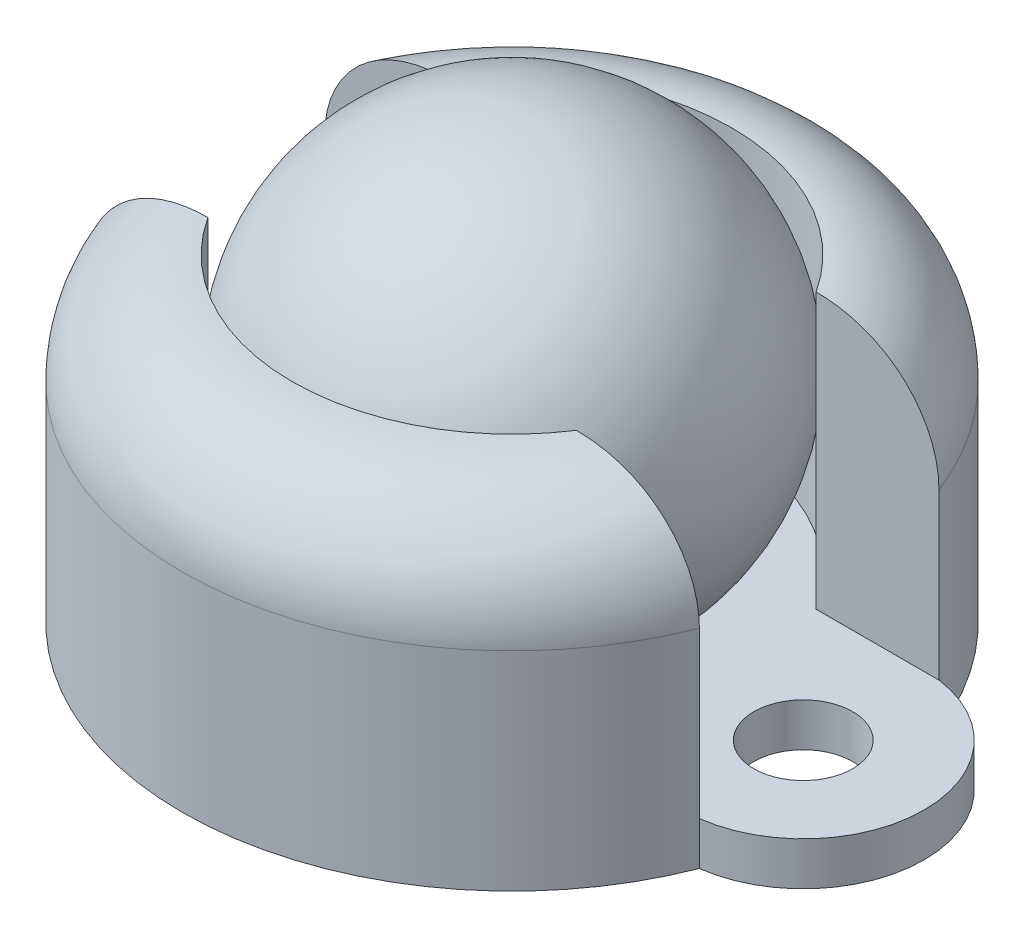
ISO-10303-21;
HEADER;
FILE_DESCRIPTION(('STEP AP214'),'2;1');
FILE_NAME('part.step','',(''),(''),'','','');
FILE_SCHEMA(('AUTOMOTIVE_DESIGN { 1 0 10303 214 1 1 1 1 }'));
ENDSEC;
DATA;
#1=APPLICATION_CONTEXT('core data for automotive mechanical design processes');
#2=APPLICATION_PROTOCOL_DEFINITION('international standard','automotive_design',2000,#1);
#3=PRODUCT_CONTEXT('',#1,'mechanical');
#4=PRODUCT('Part','Part','',(#3));
#5=PRODUCT_RELATED_PRODUCT_CATEGORY('part','',(#4));
#6=PRODUCT_DEFINITION_FORMATION('','',#4);
#7=PRODUCT_DEFINITION_CONTEXT('part definition',#1,'design');
#8=PRODUCT_DEFINITION('design','',#6,#7);
#9=PRODUCT_DEFINITION_SHAPE('','',#8);
#10=(LENGTH_UNIT() NAMED_UNIT(*) SI_UNIT(.MILLI.,.METRE.));
#11=(NAMED_UNIT(*) PLANE_ANGLE_UNIT() SI_UNIT($,.RADIAN.));
#12=(NAMED_UNIT(*) SI_UNIT($,.STERADIAN.) SOLID_ANGLE_UNIT());
#13=UNCERTAINTY_MEASURE_WITH_UNIT(LENGTH_MEASURE(1.E-05),#10,'distance_accuracy_value','');
#14=(GEOMETRIC_REPRESENTATION_CONTEXT(3) GLOBAL_UNCERTAINTY_ASSIGNED_CONTEXT((#13)) GLOBAL_UNIT_ASSIGNED_CONTEXT((#10,
#11,#12)) REPRESENTATION_CONTEXT('',''));
#15=CARTESIAN_POINT('',(0.,0.,0.));
#16=DIRECTION('',(0.,0.,1.));
#17=DIRECTION('',(1.,0.,0.));
#18=AXIS2_PLACEMENT_3D('',#15,#16,#17);
#19=CARTESIAN_POINT('',(9.525,5.08,-7.62));
#20=DIRECTION('',(0.,1.,0.));
#21=DIRECTION('',(-1.,0.,0.));
#22=AXIS2_PLACEMENT_3D('',#19,#20,#21);
#23=SPHERICAL_SURFACE('',#22,5.08);
#24=CARTESIAN_POINT('',(9.525,10.16,-7.62));
#25=VERTEX_POINT('',#24);
#26=VERTEX_LOOP('',#25);
#27=FACE_BOUND('',#26,.T.);
#28=ADVANCED_FACE('F40',(#27),#23,.T.);
#29=CLOSED_SHELL('',(#28));
#30=MANIFOLD_SOLID_BREP('B2',#29);
#31=CARTESIAN_POINT('',(6.1595,1.,-7.62));
#32=DIRECTION('',(0.,1.,0.));
#33=DIRECTION('',(0.,0.,1.));
#34=AXIS2_PLACEMENT_3D('',#31,#32,#33);
#35=PLANE('',#34);
#36=CARTESIAN_POINT('',(9.525,1.,-7.62));
#37=DIRECTION('',(0.,1.,0.));
#38=DIRECTION('',(0.,0.,1.));
#39=AXIS2_PLACEMENT_3D('',#36,#37,#38);
#40=CIRCLE('',#39,3.11073125347721);
#41=CARTESIAN_POINT('',(9.525,0.999999999999999,-10.7307312534772));
#42=VERTEX_POINT('',#41);
#43=EDGE_CURVE('E166',#42,#42,#40,.F.);
#44=ORIENTED_EDGE('',*,*,#43,.T.);
#45=EDGE_LOOP('',(#44));
#46=FACE_BOUND('',#45,.T.);
#47=CARTESIAN_POINT('',(2.794,1.,-7.62));
#48=DIRECTION('',(0.,1.,0.));
#49=DIRECTION('',(0.,0.,1.));
#50=AXIS2_PLACEMENT_3D('',#47,#48,#49);
#51=CIRCLE('',#50,1.143);
#52=CARTESIAN_POINT('',(2.794,1.,-6.477));
#53=VERTEX_POINT('',#52);
#54=EDGE_CURVE('E195',#53,#53,#51,.T.);
#55=ORIENTED_EDGE('',*,*,#54,.F.);
#56=EDGE_LOOP('',(#55));
#57=FACE_BOUND('',#56,.T.);
#58=CARTESIAN_POINT('',(16.256,1.,-7.62));
#59=DIRECTION('',(0.,1.,0.));
#60=DIRECTION('',(0.,0.,1.));
#61=AXIS2_PLACEMENT_3D('',#58,#59,#60);
#62=CIRCLE('',#61,1.143);
#63=CARTESIAN_POINT('',(16.256,1.,-6.477));
#64=VERTEX_POINT('',#63);
#65=EDGE_CURVE('E201',#64,#64,#62,.T.);
#66=ORIENTED_EDGE('',*,*,#65,.F.);
#67=EDGE_LOOP('',(#66));
#68=FACE_BOUND('',#67,.T.);
#69=CARTESIAN_POINT('',(9.525,1.,-7.62));
#70=DIRECTION('',(0.,-1.,0.));
#71=DIRECTION('',(0.,0.,1.));
#72=AXIS2_PLACEMENT_3D('',#69,#70,#71);
#73=CIRCLE('',#72,5.08);
#74=CARTESIAN_POINT('',(13.7835509398856,1.,-4.8503170050709));
#75=VERTEX_POINT('',#74);
#76=CARTESIAN_POINT('',(5.26644906011439,1.,-4.8503170050709));
#77=VERTEX_POINT('',#76);
#78=EDGE_CURVE('E162',#75,#77,#73,.T.);
#79=ORIENTED_EDGE('',*,*,#78,.F.);
#80=DIRECTION('',(-1.,0.,0.));
#81=VECTOR('',#80,1.);
#82=CARTESIAN_POINT('',(13.7835509398856,1.,-4.8503170050709));
#83=LINE('',#82,#81);
#84=CARTESIAN_POINT('',(16.623820754717,1.,-4.8503170050709));
#85=VERTEX_POINT('',#84);
#86=EDGE_CURVE('E148',#85,#75,#83,.T.);
#87=ORIENTED_EDGE('',*,*,#86,.F.);
#88=CARTESIAN_POINT('',(16.256,1.,-7.62));
#89=DIRECTION('',(0.,1.,0.));
#90=DIRECTION('',(0.,0.,1.));
#91=AXIS2_PLACEMENT_3D('',#88,#89,#90);
#92=CIRCLE('',#91,2.794);
#93=CARTESIAN_POINT('',(16.623820754717,1.,-10.3896829949291));
#94=VERTEX_POINT('',#93);
#95=EDGE_CURVE('E210',#85,#94,#92,.T.);
#96=ORIENTED_EDGE('',*,*,#95,.T.);
#97=DIRECTION('',(1.,0.,0.));
#98=VECTOR('',#97,1.);
#99=CARTESIAN_POINT('',(16.623820754717,1.,-10.3896829949291));
#100=LINE('',#99,#98);
#101=CARTESIAN_POINT('',(13.7835509398856,1.,-10.3896829949291));
#102=VERTEX_POINT('',#101);
#103=EDGE_CURVE('E177',#102,#94,#100,.T.);
#104=ORIENTED_EDGE('',*,*,#103,.F.);
#105=CARTESIAN_POINT('',(9.525,1.,-7.62));
#106=DIRECTION('',(0.,-1.,0.));
#107=DIRECTION('',(0.,0.,1.));
#108=AXIS2_PLACEMENT_3D('',#105,#106,#107);
#109=CIRCLE('',#108,5.08);
#110=CARTESIAN_POINT('',(5.26644906011439,1.,-10.3896829949291));
#111=VERTEX_POINT('',#110);
#112=EDGE_CURVE('E180',#111,#102,#109,.T.);
#113=ORIENTED_EDGE('',*,*,#112,.F.);
#114=DIRECTION('',(1.,0.,0.));
#115=VECTOR('',#114,1.);
#116=CARTESIAN_POINT('',(5.26644906011439,1.,-10.3896829949291));
#117=LINE('',#116,#115);
#118=CARTESIAN_POINT('',(2.42617924528302,1.,-10.3896829949291));
#119=VERTEX_POINT('',#118);
#120=EDGE_CURVE('E172',#119,#111,#117,.T.);
#121=ORIENTED_EDGE('',*,*,#120,.F.);
#122=CARTESIAN_POINT('',(2.794,1.,-7.62));
#123=DIRECTION('',(0.,1.,0.));
#124=DIRECTION('',(0.,0.,1.));
#125=AXIS2_PLACEMENT_3D('',#122,#123,#124);
#126=CIRCLE('',#125,2.794);
#127=CARTESIAN_POINT('',(2.42617924528302,1.,-4.8503170050709));
#128=VERTEX_POINT('',#127);
#129=EDGE_CURVE('E207',#119,#128,#126,.T.);
#130=ORIENTED_EDGE('',*,*,#129,.T.);
#131=DIRECTION('',(-1.,0.,0.));
#132=VECTOR('',#131,1.);
#133=CARTESIAN_POINT('',(2.42617924528302,1.,-4.8503170050709));
#134=LINE('',#133,#132);
#135=EDGE_CURVE('E158',#77,#128,#134,.T.);
#136=ORIENTED_EDGE('',*,*,#135,.F.);
#137=EDGE_LOOP('',(#79,#87,#96,#104,#113,#121,#130,#136));
#138=FACE_BOUND('',#137,.T.);
#139=ADVANCED_FACE('F52',(#46,#57,#68,#138),#35,.T.);
#140=CARTESIAN_POINT('',(6.1595,0.,-7.62));
#141=DIRECTION('',(0.,1.,0.));
#142=DIRECTION('',(0.,0.,1.));
#143=AXIS2_PLACEMENT_3D('',#140,#141,#142);
#144=PLANE('',#143);
#145=CARTESIAN_POINT('',(9.525,0.,-7.62));
#146=DIRECTION('',(0.,-1.,0.));
#147=DIRECTION('',(0.,0.,-1.));
#148=AXIS2_PLACEMENT_3D('',#145,#146,#147);
#149=CIRCLE('',#148,3.11073125347721);
#150=CARTESIAN_POINT('',(9.525,0.,-10.7307312534772));
#151=VERTEX_POINT('',#150);
#152=EDGE_CURVE('E442',#151,#151,#149,.T.);
#153=ORIENTED_EDGE('',*,*,#152,.F.);
#154=EDGE_LOOP('',(#153));
#155=FACE_BOUND('',#154,.T.);
#156=CARTESIAN_POINT('',(16.256,0.,-7.62));
#157=DIRECTION('',(0.,1.,0.));
#158=DIRECTION('',(0.,0.,1.));
#159=AXIS2_PLACEMENT_3D('',#156,#157,#158);
#160=CIRCLE('',#159,1.143);
#161=CARTESIAN_POINT('',(16.256,0.,-6.477));
#162=VERTEX_POINT('',#161);
#163=EDGE_CURVE('E198',#162,#162,#160,.T.);
#164=ORIENTED_EDGE('',*,*,#163,.T.);
#165=EDGE_LOOP('',(#164));
#166=FACE_BOUND('',#165,.T.);
#167=CARTESIAN_POINT('',(9.525,0.,-7.62));
#168=DIRECTION('',(0.,1.,0.));
#169=DIRECTION('',(0.,0.,1.));
#170=AXIS2_PLACEMENT_3D('',#167,#168,#169);
#171=CIRCLE('',#170,7.62);
#172=CARTESIAN_POINT('',(16.623820754717,0.,-10.3896829949291));
#173=VERTEX_POINT('',#172);
#174=CARTESIAN_POINT('',(2.42617924528302,0.,-10.3896829949291));
#175=VERTEX_POINT('',#174);
#176=EDGE_CURVE('E204',#173,#175,#171,.T.);
#177=ORIENTED_EDGE('',*,*,#176,.F.);
#178=CARTESIAN_POINT('',(16.256,0.,-7.62));
#179=DIRECTION('',(0.,1.,0.));
#180=DIRECTION('',(0.,0.,1.));
#181=AXIS2_PLACEMENT_3D('',#178,#179,#180);
#182=CIRCLE('',#181,2.794);
#183=CARTESIAN_POINT('',(16.623820754717,0.,-4.8503170050709));
#184=VERTEX_POINT('',#183);
#185=EDGE_CURVE('E211',#184,#173,#182,.T.);
#186=ORIENTED_EDGE('',*,*,#185,.F.);
#187=CARTESIAN_POINT('',(9.525,0.,-7.62));
#188=DIRECTION('',(0.,1.,0.));
#189=DIRECTION('',(0.,0.,1.));
#190=AXIS2_PLACEMENT_3D('',#187,#188,#189);
#191=CIRCLE('',#190,7.62);
#192=CARTESIAN_POINT('',(2.42617924528302,0.,-4.8503170050709));
#193=VERTEX_POINT('',#192);
#194=EDGE_CURVE('E219',#193,#184,#191,.T.);
#195=ORIENTED_EDGE('',*,*,#194,.F.);
#196=CARTESIAN_POINT('',(2.794,0.,-7.62));
#197=DIRECTION('',(0.,1.,0.));
#198=DIRECTION('',(0.,0.,1.));
#199=AXIS2_PLACEMENT_3D('',#196,#197,#198);
#200=CIRCLE('',#199,2.794);
#201=EDGE_CURVE('E217',#175,#193,#200,.T.);
#202=ORIENTED_EDGE('',*,*,#201,.F.);
#203=EDGE_LOOP('',(#177,#186,#195,#202));
#204=FACE_BOUND('',#203,.T.);
#205=CARTESIAN_POINT('',(2.794,0.,-7.62));
#206=DIRECTION('',(0.,1.,0.));
#207=DIRECTION('',(0.,0.,1.));
#208=AXIS2_PLACEMENT_3D('',#205,#206,#207);
#209=CIRCLE('',#208,1.143);
#210=CARTESIAN_POINT('',(2.794,0.,-6.477));
#211=VERTEX_POINT('',#210);
#212=EDGE_CURVE('E194',#211,#211,#209,.T.);
#213=ORIENTED_EDGE('',*,*,#212,.T.);
#214=EDGE_LOOP('',(#213));
#215=FACE_BOUND('',#214,.T.);
#216=ADVANCED_FACE('F280',(#155,#166,#204,#215),#144,.F.);
#217=CARTESIAN_POINT('',(9.525,1.,-7.62));
#218=DIRECTION('',(0.,-1.,0.));
#219=DIRECTION('',(0.,0.,-1.));
#220=AXIS2_PLACEMENT_3D('',#217,#218,#219);
#221=CYLINDRICAL_SURFACE('',#220,7.62);
#222=DIRECTION('',(0.,-1.,0.));
#223=VECTOR('',#222,1.);
#224=CARTESIAN_POINT('',(2.42617924528302,7.35,-10.3896829949291));
#225=LINE('',#224,#223);
#226=CARTESIAN_POINT('',(2.42617924528302,4.81,-10.3896829949291));
#227=VERTEX_POINT('',#226);
#228=EDGE_CURVE('E192',#227,#119,#225,.T.);
#229=ORIENTED_EDGE('',*,*,#228,.F.);
#230=CARTESIAN_POINT('',(9.525,4.81,-7.62));
#231=DIRECTION('',(0.,1.,0.));
#232=DIRECTION('',(0.,0.,1.));
#233=AXIS2_PLACEMENT_3D('',#230,#231,#232);
#234=CIRCLE('',#233,7.62);
#235=CARTESIAN_POINT('',(16.623820754717,4.81,-10.3896829949291));
#236=VERTEX_POINT('',#235);
#237=EDGE_CURVE('E65',#227,#236,#234,.F.);
#238=ORIENTED_EDGE('',*,*,#237,.T.);
#239=DIRECTION('',(0.,-1.,0.));
#240=VECTOR('',#239,1.);
#241=CARTESIAN_POINT('',(16.623820754717,7.35,-10.3896829949291));
#242=LINE('',#241,#240);
#243=EDGE_CURVE('E176',#236,#94,#242,.T.);
#244=ORIENTED_EDGE('',*,*,#243,.T.);
#245=DIRECTION('',(0.,-1.,0.));
#246=VECTOR('',#245,1.);
#247=CARTESIAN_POINT('',(16.623820754717,1.,-10.3896829949291));
#248=LINE('',#247,#246);
#249=EDGE_CURVE('E214',#94,#173,#248,.T.);
#250=ORIENTED_EDGE('',*,*,#249,.T.);
#251=ORIENTED_EDGE('',*,*,#176,.T.);
#252=DIRECTION('',(0.,-1.,0.));
#253=VECTOR('',#252,1.);
#254=CARTESIAN_POINT('',(2.42617924528302,1.,-10.3896829949291));
#255=LINE('',#254,#253);
#256=EDGE_CURVE('E141',#119,#175,#255,.T.);
#257=ORIENTED_EDGE('',*,*,#256,.F.);
#258=EDGE_LOOP('',(#229,#238,#244,#250,#251,#257));
#259=FACE_BOUND('',#258,.T.);
#260=ADVANCED_FACE('F286',(#259),#221,.T.);
#261=CARTESIAN_POINT('',(2.794,1.,-7.62));
#262=DIRECTION('',(0.,-1.,0.));
#263=DIRECTION('',(0.,0.,-1.));
#264=AXIS2_PLACEMENT_3D('',#261,#262,#263);
#265=CYLINDRICAL_SURFACE('',#264,2.794);
#266=ORIENTED_EDGE('',*,*,#201,.T.);
#267=DIRECTION('',(0.,-1.,0.));
#268=VECTOR('',#267,1.);
#269=CARTESIAN_POINT('',(2.42617924528302,1.,-4.8503170050709));
#270=LINE('',#269,#268);
#271=EDGE_CURVE('E227',#128,#193,#270,.T.);
#272=ORIENTED_EDGE('',*,*,#271,.F.);
#273=ORIENTED_EDGE('',*,*,#129,.F.);
#274=ORIENTED_EDGE('',*,*,#256,.T.);
#275=EDGE_LOOP('',(#266,#272,#273,#274));
#276=FACE_BOUND('',#275,.T.);
#277=ADVANCED_FACE('F300',(#276),#265,.T.);
#278=CARTESIAN_POINT('',(9.525,1.,-7.62));
#279=DIRECTION('',(0.,-1.,0.));
#280=DIRECTION('',(0.,0.,-1.));
#281=AXIS2_PLACEMENT_3D('',#278,#279,#280);
#282=CYLINDRICAL_SURFACE('',#281,7.62);
#283=DIRECTION('',(0.,-1.,0.));
#284=VECTOR('',#283,1.);
#285=CARTESIAN_POINT('',(16.623820754717,7.35,-4.8503170050709));
#286=LINE('',#285,#284);
#287=CARTESIAN_POINT('',(16.623820754717,4.81,-4.8503170050709));
#288=VERTEX_POINT('',#287);
#289=EDGE_CURVE('E151',#288,#85,#286,.T.);
#290=ORIENTED_EDGE('',*,*,#289,.F.);
#291=CARTESIAN_POINT('',(9.525,4.81,-7.62));
#292=DIRECTION('',(0.,1.,0.));
#293=DIRECTION('',(0.,0.,1.));
#294=AXIS2_PLACEMENT_3D('',#291,#292,#293);
#295=CIRCLE('',#294,7.62);
#296=CARTESIAN_POINT('',(2.42617924528302,4.81,-4.8503170050709));
#297=VERTEX_POINT('',#296);
#298=EDGE_CURVE('E138',#288,#297,#295,.F.);
#299=ORIENTED_EDGE('',*,*,#298,.T.);
#300=DIRECTION('',(0.,-1.,0.));
#301=VECTOR('',#300,1.);
#302=CARTESIAN_POINT('',(2.42617924528302,7.35,-4.8503170050709));
#303=LINE('',#302,#301);
#304=EDGE_CURVE('E157',#297,#128,#303,.T.);
#305=ORIENTED_EDGE('',*,*,#304,.T.);
#306=ORIENTED_EDGE('',*,*,#271,.T.);
#307=ORIENTED_EDGE('',*,*,#194,.T.);
#308=DIRECTION('',(0.,-1.,0.));
#309=VECTOR('',#308,1.);
#310=CARTESIAN_POINT('',(16.623820754717,1.,-4.8503170050709));
#311=LINE('',#310,#309);
#312=EDGE_CURVE('E224',#85,#184,#311,.T.);
#313=ORIENTED_EDGE('',*,*,#312,.F.);
#314=EDGE_LOOP('',(#290,#299,#305,#306,#307,#313));
#315=FACE_BOUND('',#314,.T.);
#316=ADVANCED_FACE('F296',(#315),#282,.T.);
#317=CARTESIAN_POINT('',(16.256,1.,-7.62));
#318=DIRECTION('',(0.,-1.,0.));
#319=DIRECTION('',(0.,0.,-1.));
#320=AXIS2_PLACEMENT_3D('',#317,#318,#319);
#321=CYLINDRICAL_SURFACE('',#320,2.794);
#322=ORIENTED_EDGE('',*,*,#185,.T.);
#323=ORIENTED_EDGE('',*,*,#249,.F.);
#324=ORIENTED_EDGE('',*,*,#95,.F.);
#325=ORIENTED_EDGE('',*,*,#312,.T.);
#326=EDGE_LOOP('',(#322,#323,#324,#325));
#327=FACE_BOUND('',#326,.T.);
#328=ADVANCED_FACE('F293',(#327),#321,.T.);
#329=CARTESIAN_POINT('',(16.256,1.,-7.62));
#330=DIRECTION('',(0.,-1.,0.));
#331=DIRECTION('',(0.,0.,-1.));
#332=AXIS2_PLACEMENT_3D('',#329,#330,#331);
#333=CYLINDRICAL_SURFACE('',#332,1.143);
#334=ORIENTED_EDGE('',*,*,#65,.T.);
#335=EDGE_LOOP('',(#334));
#336=FACE_BOUND('',#335,.T.);
#337=ORIENTED_EDGE('',*,*,#163,.F.);
#338=EDGE_LOOP('',(#337));
#339=FACE_BOUND('',#338,.T.);
#340=ADVANCED_FACE('F291',(#336,#339),#333,.F.);
#341=CARTESIAN_POINT('',(2.794,1.,-7.62));
#342=DIRECTION('',(0.,-1.,0.));
#343=DIRECTION('',(0.,0.,-1.));
#344=AXIS2_PLACEMENT_3D('',#341,#342,#343);
#345=CYLINDRICAL_SURFACE('',#344,1.143);
#346=ORIENTED_EDGE('',*,*,#54,.T.);
#347=EDGE_LOOP('',(#346));
#348=FACE_BOUND('',#347,.T.);
#349=ORIENTED_EDGE('',*,*,#212,.F.);
#350=EDGE_LOOP('',(#349));
#351=FACE_BOUND('',#350,.T.);
#352=ADVANCED_FACE('F256',(#348,#351),#345,.F.);
#353=CARTESIAN_POINT('',(5.26644906011439,7.35,-10.3896829949291));
#354=DIRECTION('',(0.,0.,-1.));
#355=DIRECTION('',(-1.,0.,0.));
#356=AXIS2_PLACEMENT_3D('',#353,#354,#355);
#357=PLANE('',#356);
#358=DIRECTION('',(0.,-1.,0.));
#359=VECTOR('',#358,1.);
#360=CARTESIAN_POINT('',(5.26644906011439,7.35,-10.3896829949291));
#361=LINE('',#360,#359);
#362=CARTESIAN_POINT('',(5.26644906011439,7.35,-10.3896829949291));
#363=VERTEX_POINT('',#362);
#364=EDGE_CURVE('E189',#363,#111,#361,.T.);
#365=ORIENTED_EDGE('',*,*,#364,.F.);
#366=CARTESIAN_POINT('',(5.26644906011439,7.35,-10.3896829949291));
#367=CARTESIAN_POINT('',(5.17678454034011,7.35001114301184,-10.3896829949291));
#368=CARTESIAN_POINT('',(5.08709035167764,7.34666318377569,-10.3896829949291));
#369=CARTESIAN_POINT('',(4.9081687511275,7.33294182209064,-10.3896829949291));
#370=CARTESIAN_POINT('',(4.81894180117011,7.32256244628566,-10.3896829949291));
#371=CARTESIAN_POINT('',(4.64107123501664,7.29438057945804,-10.3896829949291));
#372=CARTESIAN_POINT('',(4.55243494401416,7.27653127182482,-10.3896829949291));
#373=CARTESIAN_POINT('',(4.37706396337135,7.23319933483167,-10.3896829949291));
#374=CARTESIAN_POINT('',(4.29032878552236,7.20771869045276,-10.3896829949291));
#375=CARTESIAN_POINT('',(4.11903510750667,7.1488347460405,-10.3896829949291));
#376=CARTESIAN_POINT('',(4.03449151552459,7.11538788118175,-10.3896829949291));
#377=CARTESIAN_POINT('',(3.86895239000286,7.04064292127525,-10.3896829949291));
#378=CARTESIAN_POINT('',(3.78795644179326,6.99934574684835,-10.3896829949291));
#379=CARTESIAN_POINT('',(3.63061048251926,6.90912848125866,-10.3896829949291));
#380=CARTESIAN_POINT('',(3.55424803319991,6.86023017917681,-10.3896829949291));
#381=CARTESIAN_POINT('',(3.40686682866429,6.75501343573417,-10.3896829949291));
#382=CARTESIAN_POINT('',(3.33584702685674,6.69869645362427,-10.3896829949291));
#383=CARTESIAN_POINT('',(3.15012624930728,6.53498401032006,-10.3896829949291));
#384=CARTESIAN_POINT('',(3.04158627175307,6.4204175341252,-10.3896829949291));
#385=CARTESIAN_POINT('',(2.84777585848162,6.17297593284659,-10.3896829949291));
#386=CARTESIAN_POINT('',(2.76251200346626,6.04009564596838,-10.3896829949291));
#387=CARTESIAN_POINT('',(2.62600826780199,5.77392960898687,-10.3896829949291));
#388=CARTESIAN_POINT('',(2.57228418304128,5.64191284328987,-10.3896829949291));
#389=CARTESIAN_POINT('',(2.4891437345482,5.37058554296885,-10.3896829949291));
#390=CARTESIAN_POINT('',(2.45967774291546,5.23129052280352,-10.3896829949291));
#391=CARTESIAN_POINT('',(2.43731254898599,5.0440796686978,-10.3896829949291));
#392=CARTESIAN_POINT('',(2.43313647619791,4.99732352363476,-10.3896829949291));
#393=CARTESIAN_POINT('',(2.42757358486635,4.90371887924745,-10.3896829949291));
#394=CARTESIAN_POINT('',(2.42618241588989,4.85687063858525,-10.3896829949291));
#395=CARTESIAN_POINT('',(2.42617924528288,4.81000000000002,-10.3896829949291));
#396=B_SPLINE_CURVE_WITH_KNOTS('',3,(#366,#367,#368,#369,#370,#371,#372,#373,#374,#375,#376,
#377,#378,#379,#380,#381,#382,#383,#384,#385,#386,#387,#388,#389,#390,#391,#392,#393,#394,#395),
.UNSPECIFIED.,.F.,.F.,(4,2,2,2,2,2,2,2,2,2,2,2,2,2,4),(0.,0.268974742641966,0.538178272763039,
0.809094876620579,1.07994107368282,1.35230390400546,1.62463481349964,1.89619899630935,
2.16770984211061,2.63833307617677,3.1090892289134,3.53455417736994,3.95914651911413,
4.09991316025373,4.24045973087649),.UNSPECIFIED.);
#397=EDGE_CURVE('E79',#363,#227,#396,.T.);
#398=ORIENTED_EDGE('',*,*,#397,.T.);
#399=ORIENTED_EDGE('',*,*,#228,.T.);
#400=ORIENTED_EDGE('',*,*,#120,.T.);
#401=EDGE_LOOP('',(#365,#398,#399,#400));
#402=FACE_BOUND('',#401,.T.);
#403=ADVANCED_FACE('F251',(#402),#357,.F.);
#404=CARTESIAN_POINT('',(9.525,7.35,-7.62));
#405=DIRECTION('',(0.,-1.,0.));
#406=DIRECTION('',(0.,0.,-1.));
#407=AXIS2_PLACEMENT_3D('',#404,#405,#406);
#408=CYLINDRICAL_SURFACE('',#407,5.08);
#409=ORIENTED_EDGE('',*,*,#112,.T.);
#410=DIRECTION('',(0.,-1.,0.));
#411=VECTOR('',#410,1.);
#412=CARTESIAN_POINT('',(13.7835509398856,7.35,-10.3896829949291));
#413=LINE('',#412,#411);
#414=CARTESIAN_POINT('',(13.7835509398856,7.35,-10.3896829949291));
#415=VERTEX_POINT('',#414);
#416=EDGE_CURVE('E186',#415,#102,#413,.T.);
#417=ORIENTED_EDGE('',*,*,#416,.F.);
#418=CARTESIAN_POINT('',(9.525,7.35,-7.62));
#419=DIRECTION('',(0.,-1.,0.));
#420=DIRECTION('',(0.,0.,1.));
#421=AXIS2_PLACEMENT_3D('',#418,#419,#420);
#422=CIRCLE('',#421,5.08);
#423=EDGE_CURVE('E173',#363,#415,#422,.T.);
#424=ORIENTED_EDGE('',*,*,#423,.F.);
#425=ORIENTED_EDGE('',*,*,#364,.T.);
#426=EDGE_LOOP('',(#409,#417,#424,#425));
#427=FACE_BOUND('',#426,.T.);
#428=ADVANCED_FACE('F247',(#427),#408,.F.);
#429=CARTESIAN_POINT('',(16.623820754717,7.35,-10.3896829949291));
#430=DIRECTION('',(0.,0.,-1.));
#431=DIRECTION('',(-1.,0.,0.));
#432=AXIS2_PLACEMENT_3D('',#429,#430,#431);
#433=PLANE('',#432);
#434=ORIENTED_EDGE('',*,*,#243,.F.);
#435=CARTESIAN_POINT('',(16.623820754717,4.81,-10.3896829949291));
#436=CARTESIAN_POINT('',(16.6238294758465,4.87753487017368,-10.3896829949291));
#437=CARTESIAN_POINT('',(16.6209296585075,4.94506558061485,-10.3896829949291));
#438=CARTESIAN_POINT('',(16.6093799939002,5.07962412517109,-10.3896829949291));
#439=CARTESIAN_POINT('',(16.6007309674432,5.14665202969018,-10.3896829949291));
#440=CARTESIAN_POINT('',(16.5777753836263,5.27958237028461,-10.3896829949291));
#441=CARTESIAN_POINT('',(16.5634814179348,5.34548697300761,-10.3896829949291));
#442=CARTESIAN_POINT('',(16.5293806539561,5.47583540913131,-10.3896829949291));
#443=CARTESIAN_POINT('',(16.5095738284585,5.54027923532022,-10.3896829949291));
#444=CARTESIAN_POINT('',(16.4421206685347,5.73074347465564,-10.3896829949291));
#445=CARTESIAN_POINT('',(16.3864209511575,5.85401513642086,-10.3896829949291));
#446=CARTESIAN_POINT('',(16.2555451501697,6.08966356295821,-10.3896829949291));
#447=CARTESIAN_POINT('',(16.1803638697385,6.20203740966577,-10.3896829949291));
#448=CARTESIAN_POINT('',(16.0112232916338,6.41552780767406,-10.3896829949291));
#449=CARTESIAN_POINT('',(15.9169012884716,6.51635684028777,-10.3896829949291));
#450=CARTESIAN_POINT('',(15.7135796651386,6.70181738451991,-10.3896829949291));
#451=CARTESIAN_POINT('',(15.6045812423863,6.78645021619014,-10.3896829949291));
#452=CARTESIAN_POINT('',(15.367968521372,6.94292749640816,-10.3896829949291));
#453=CARTESIAN_POINT('',(15.2396204440162,7.01366015319299,-10.3896829949291));
#454=CARTESIAN_POINT('',(14.9735537276223,7.13483540201934,-10.3896829949291));
#455=CARTESIAN_POINT('',(14.8358217967293,7.18524848307452,-10.3896829949291));
#456=CARTESIAN_POINT('',(14.5470195480957,7.26800625190271,-10.3896829949291));
#457=CARTESIAN_POINT('',(14.3956300337775,7.29923693953247,-10.3896829949291));
#458=CARTESIAN_POINT('',(14.1667963992329,7.32997893904557,-10.3896829949291));
#459=CARTESIAN_POINT('',(14.0903258096135,7.33754283847577,-10.3896829949291));
#460=CARTESIAN_POINT('',(13.9370918471304,7.3475516478315,-10.3896829949291));
#461=CARTESIAN_POINT('',(13.8603286675972,7.34999949460755,-10.3896829949291));
#462=CARTESIAN_POINT('',(13.7835509398856,7.35,-10.3896829949291));
#463=B_SPLINE_CURVE_WITH_KNOTS('',3,(#435,#436,#437,#438,#439,#440,#441,#442,#443,#444,#445,
#446,#447,#448,#449,#450,#451,#452,#453,#454,#455,#456,#457,#458,#459,#460,#461,#462),
.UNSPECIFIED.,.F.,.F.,(4,2,2,2,2,2,2,2,2,2,2,2,2,4),(0.,0.202535153257618,0.405041396903403,
0.607098456257561,0.809156512940331,1.21291634149454,1.61678398641658,2.02917222371698,
2.4415268354837,2.87933367699337,3.31777409254857,3.77972797929438,4.01011675222777,
4.24037323499854),.UNSPECIFIED.);
#464=EDGE_CURVE('E38',#236,#415,#463,.T.);
#465=ORIENTED_EDGE('',*,*,#464,.T.);
#466=ORIENTED_EDGE('',*,*,#416,.T.);
#467=ORIENTED_EDGE('',*,*,#103,.T.);
#468=EDGE_LOOP('',(#434,#465,#466,#467));
#469=FACE_BOUND('',#468,.T.);
#470=ADVANCED_FACE('F242',(#469),#433,.F.);
#471=CARTESIAN_POINT('',(13.7835509398856,7.35,-4.8503170050709));
#472=DIRECTION('',(0.,0.,1.));
#473=DIRECTION('',(1.,0.,0.));
#474=AXIS2_PLACEMENT_3D('',#471,#472,#473);
#475=PLANE('',#474);
#476=DIRECTION('',(0.,-1.,0.));
#477=VECTOR('',#476,1.);
#478=CARTESIAN_POINT('',(13.7835509398856,7.35,-4.8503170050709));
#479=LINE('',#478,#477);
#480=CARTESIAN_POINT('',(13.7835509398856,7.35,-4.8503170050709));
#481=VERTEX_POINT('',#480);
#482=EDGE_CURVE('E145',#481,#75,#479,.T.);
#483=ORIENTED_EDGE('',*,*,#482,.F.);
#484=CARTESIAN_POINT('',(13.7835509398856,7.35,-4.8503170050709));
#485=CARTESIAN_POINT('',(13.8732154596599,7.35001114301184,-4.8503170050709));
#486=CARTESIAN_POINT('',(13.9629096483224,7.34666318377569,-4.8503170050709));
#487=CARTESIAN_POINT('',(14.1418312488725,7.33294182209064,-4.8503170050709));
#488=CARTESIAN_POINT('',(14.2310581988299,7.32256244628566,-4.8503170050709));
#489=CARTESIAN_POINT('',(14.4089287649834,7.29438057945804,-4.8503170050709));
#490=CARTESIAN_POINT('',(14.4975650559858,7.27653127182482,-4.8503170050709));
#491=CARTESIAN_POINT('',(14.6729360366286,7.23319933483167,-4.8503170050709));
#492=CARTESIAN_POINT('',(14.7596712144776,7.20771869045276,-4.8503170050709));
#493=CARTESIAN_POINT('',(14.9309648924933,7.1488347460405,-4.8503170050709));
#494=CARTESIAN_POINT('',(15.0155084844754,7.11538788118175,-4.8503170050709));
#495=CARTESIAN_POINT('',(15.1810476099971,7.04064292127525,-4.8503170050709));
#496=CARTESIAN_POINT('',(15.2620435582067,6.99934574684835,-4.8503170050709));
#497=CARTESIAN_POINT('',(15.4193895174807,6.90912848125866,-4.8503170050709));
#498=CARTESIAN_POINT('',(15.4957519668001,6.86023017917681,-4.8503170050709));
#499=CARTESIAN_POINT('',(15.6431331713357,6.75501343573417,-4.8503170050709));
#500=CARTESIAN_POINT('',(15.7141529731433,6.69869645362427,-4.8503170050709));
#501=CARTESIAN_POINT('',(15.8998737506927,6.53498401032005,-4.8503170050709));
#502=CARTESIAN_POINT('',(16.0084137282469,6.4204175341252,-4.8503170050709));
#503=CARTESIAN_POINT('',(16.2022241415184,6.17297593284659,-4.8503170050709));
#504=CARTESIAN_POINT('',(16.2874879965337,6.04009564596838,-4.8503170050709));
#505=CARTESIAN_POINT('',(16.423991732198,5.77392960898687,-4.8503170050709));
#506=CARTESIAN_POINT('',(16.4777158169587,5.64191284328986,-4.8503170050709));
#507=CARTESIAN_POINT('',(16.5608562654518,5.37058554296885,-4.8503170050709));
#508=CARTESIAN_POINT('',(16.5903222570845,5.23129052280352,-4.8503170050709));
#509=CARTESIAN_POINT('',(16.612687451014,5.04407966869779,-4.8503170050709));
#510=CARTESIAN_POINT('',(16.6168635238021,4.99732352363475,-4.8503170050709));
#511=CARTESIAN_POINT('',(16.6224264151336,4.90371887924744,-4.8503170050709));
#512=CARTESIAN_POINT('',(16.6238175841101,4.85687063858525,-4.8503170050709));
#513=CARTESIAN_POINT('',(16.6238207547171,4.81000000000002,-4.8503170050709));
#514=B_SPLINE_CURVE_WITH_KNOTS('',3,(#484,#485,#486,#487,#488,#489,#490,#491,#492,#493,#494,
#495,#496,#497,#498,#499,#500,#501,#502,#503,#504,#505,#506,#507,#508,#509,#510,#511,#512,#513),
.UNSPECIFIED.,.F.,.F.,(4,2,2,2,2,2,2,2,2,2,2,2,2,2,4),(0.,0.268974742641966,0.53817827276304,
0.80909487662058,1.07994107368283,1.35230390400547,1.62463481349964,1.89619899630936,
2.16770984211061,2.63833307617678,3.1090892289134,3.53455417736994,3.95914651911413,
4.09991316025373,4.24045973087649),.UNSPECIFIED.);
#515=EDGE_CURVE('E132',#481,#288,#514,.T.);
#516=ORIENTED_EDGE('',*,*,#515,.T.);
#517=ORIENTED_EDGE('',*,*,#289,.T.);
#518=ORIENTED_EDGE('',*,*,#86,.T.);
#519=EDGE_LOOP('',(#483,#516,#517,#518));
#520=FACE_BOUND('',#519,.T.);
#521=ADVANCED_FACE('F146',(#520),#475,.F.);
#522=CARTESIAN_POINT('',(9.525,7.35,-7.62));
#523=DIRECTION('',(0.,-1.,0.));
#524=DIRECTION('',(0.,0.,-1.));
#525=AXIS2_PLACEMENT_3D('',#522,#523,#524);
#526=CYLINDRICAL_SURFACE('',#525,5.08);
#527=ORIENTED_EDGE('',*,*,#78,.T.);
#528=DIRECTION('',(0.,-1.,0.));
#529=VECTOR('',#528,1.);
#530=CARTESIAN_POINT('',(5.26644906011439,7.35,-4.8503170050709));
#531=LINE('',#530,#529);
#532=CARTESIAN_POINT('',(5.26644906011439,7.35,-4.8503170050709));
#533=VERTEX_POINT('',#532);
#534=EDGE_CURVE('E152',#533,#77,#531,.T.);
#535=ORIENTED_EDGE('',*,*,#534,.F.);
#536=CARTESIAN_POINT('',(9.525,7.35,-7.62));
#537=DIRECTION('',(0.,-1.,0.));
#538=DIRECTION('',(0.,0.,1.));
#539=AXIS2_PLACEMENT_3D('',#536,#537,#538);
#540=CIRCLE('',#539,5.08);
#541=EDGE_CURVE('E137',#481,#533,#540,.T.);
#542=ORIENTED_EDGE('',*,*,#541,.F.);
#543=ORIENTED_EDGE('',*,*,#482,.T.);
#544=EDGE_LOOP('',(#527,#535,#542,#543));
#545=FACE_BOUND('',#544,.T.);
#546=ADVANCED_FACE('F155',(#545),#526,.F.);
#547=CARTESIAN_POINT('',(2.42617924528302,7.35,-4.8503170050709));
#548=DIRECTION('',(0.,0.,1.));
#549=DIRECTION('',(1.,0.,0.));
#550=AXIS2_PLACEMENT_3D('',#547,#548,#549);
#551=PLANE('',#550);
#552=ORIENTED_EDGE('',*,*,#304,.F.);
#553=CARTESIAN_POINT('',(2.42617924528302,4.81,-4.8503170050709));
#554=CARTESIAN_POINT('',(2.42617052415345,4.87753487017368,-4.8503170050709));
#555=CARTESIAN_POINT('',(2.42907034149253,4.94506558061485,-4.8503170050709));
#556=CARTESIAN_POINT('',(2.44062000609976,5.07962412517108,-4.8503170050709));
#557=CARTESIAN_POINT('',(2.44926903255683,5.14665202969018,-4.8503170050709));
#558=CARTESIAN_POINT('',(2.47222461637367,5.27958237028461,-4.8503170050709));
#559=CARTESIAN_POINT('',(2.48651858206518,5.34548697300761,-4.8503170050709));
#560=CARTESIAN_POINT('',(2.52061934604391,5.47583540913131,-4.8503170050709));
#561=CARTESIAN_POINT('',(2.54042617154146,5.54027923532022,-4.8503170050709));
#562=CARTESIAN_POINT('',(2.60787933146526,5.73074347465564,-4.8503170050709));
#563=CARTESIAN_POINT('',(2.66357904884252,5.85401513642086,-4.8503170050709));
#564=CARTESIAN_POINT('',(2.79445484983026,6.08966356295821,-4.8503170050709));
#565=CARTESIAN_POINT('',(2.8696361302615,6.20203740966577,-4.8503170050709));
#566=CARTESIAN_POINT('',(3.03877670836616,6.41552780767406,-4.8503170050709));
#567=CARTESIAN_POINT('',(3.13309871152839,6.51635684028777,-4.8503170050709));
#568=CARTESIAN_POINT('',(3.3364203348614,6.70181738451991,-4.8503170050709));
#569=CARTESIAN_POINT('',(3.44541875761366,6.78645021619014,-4.8503170050709));
#570=CARTESIAN_POINT('',(3.682031478628,6.94292749640816,-4.8503170050709));
#571=CARTESIAN_POINT('',(3.81037955598378,7.01366015319299,-4.8503170050709));
#572=CARTESIAN_POINT('',(4.07644627237774,7.13483540201934,-4.8503170050709));
#573=CARTESIAN_POINT('',(4.21417820327072,7.18524848307452,-4.8503170050709));
#574=CARTESIAN_POINT('',(4.50298045190432,7.26800625190271,-4.8503170050709));
#575=CARTESIAN_POINT('',(4.65436996622247,7.29923693953247,-4.8503170050709));
#576=CARTESIAN_POINT('',(4.88320360076712,7.32997893904557,-4.8503170050709));
#577=CARTESIAN_POINT('',(4.95967419038653,7.33754283847577,-4.8503170050709));
#578=CARTESIAN_POINT('',(5.11290815286962,7.3475516478315,-4.8503170050709));
#579=CARTESIAN_POINT('',(5.18967133240282,7.34999949460755,-4.8503170050709));
#580=CARTESIAN_POINT('',(5.26644906011439,7.35,-4.8503170050709));
#581=B_SPLINE_CURVE_WITH_KNOTS('',3,(#553,#554,#555,#556,#557,#558,#559,#560,#561,#562,#563,
#564,#565,#566,#567,#568,#569,#570,#571,#572,#573,#574,#575,#576,#577,#578,#579,#580),
.UNSPECIFIED.,.F.,.F.,(4,2,2,2,2,2,2,2,2,2,2,2,2,4),(0.,0.202535153257616,0.405041396903403,
0.607098456257562,0.809156512940331,1.21291634149454,1.61678398641658,2.02917222371698,
2.44152683548371,2.87933367699337,3.31777409254857,3.77972797929438,4.01011675222778,
4.24037323499854),.UNSPECIFIED.);
#582=EDGE_CURVE('E262',#297,#533,#581,.T.);
#583=ORIENTED_EDGE('',*,*,#582,.T.);
#584=ORIENTED_EDGE('',*,*,#534,.T.);
#585=ORIENTED_EDGE('',*,*,#135,.T.);
#586=EDGE_LOOP('',(#552,#583,#584,#585));
#587=FACE_BOUND('',#586,.T.);
#588=ADVANCED_FACE('F266',(#587),#551,.F.);
#589=CARTESIAN_POINT('',(9.525,9.79847665513065,-7.62));
#590=DIRECTION('',(0.,-1.,0.));
#591=DIRECTION('',(0.,0.,-1.));
#592=AXIS2_PLACEMENT_3D('',#589,#590,#591);
#593=CYLINDRICAL_SURFACE('',#592,3.11073125347721);
#594=CARTESIAN_POINT('',(9.525,0.,-10.7307312534772));
#595=CARTESIAN_POINT('',(9.525,0.0104166666666684,-10.7307312534772));
#596=CARTESIAN_POINT('',(9.525,0.0208333333333351,-10.7307312534772));
#597=CARTESIAN_POINT('',(9.525,0.0416666666666684,-10.7307312534772));
#598=CARTESIAN_POINT('',(9.525,0.0520833333333351,-10.7307312534772));
#599=CARTESIAN_POINT('',(9.525,0.0729166666666685,-10.7307312534772));
#600=CARTESIAN_POINT('',(9.525,0.0833333333333351,-10.7307312534772));
#601=CARTESIAN_POINT('',(9.525,0.104166666666669,-10.7307312534772));
#602=CARTESIAN_POINT('',(9.525,0.114583333333335,-10.7307312534772));
#603=CARTESIAN_POINT('',(9.525,0.135416666666669,-10.7307312534772));
#604=CARTESIAN_POINT('',(9.525,0.145833333333335,-10.7307312534772));
#605=CARTESIAN_POINT('',(9.525,0.166666666666669,-10.7307312534772));
#606=CARTESIAN_POINT('',(9.525,0.177083333333335,-10.7307312534772));
#607=CARTESIAN_POINT('',(9.525,0.197916666666669,-10.7307312534772));
#608=CARTESIAN_POINT('',(9.525,0.208333333333335,-10.7307312534772));
#609=CARTESIAN_POINT('',(9.525,0.229166666666669,-10.7307312534772));
#610=CARTESIAN_POINT('',(9.525,0.239583333333335,-10.7307312534772));
#611=CARTESIAN_POINT('',(9.525,0.260416666666668,-10.7307312534772));
#612=CARTESIAN_POINT('',(9.525,0.270833333333334,-10.7307312534772));
#613=CARTESIAN_POINT('',(9.525,0.291666666666667,-10.7307312534772));
#614=CARTESIAN_POINT('',(9.525,0.302083333333334,-10.7307312534772));
#615=CARTESIAN_POINT('',(9.525,0.322916666666667,-10.7307312534772));
#616=CARTESIAN_POINT('',(9.525,0.333333333333334,-10.7307312534772));
#617=CARTESIAN_POINT('',(9.525,0.354166666666667,-10.7307312534772));
#618=CARTESIAN_POINT('',(9.525,0.364583333333334,-10.7307312534772));
#619=CARTESIAN_POINT('',(9.525,0.385416666666667,-10.7307312534772));
#620=CARTESIAN_POINT('',(9.525,0.395833333333334,-10.7307312534772));
#621=CARTESIAN_POINT('',(9.525,0.416666666666667,-10.7307312534772));
#622=CARTESIAN_POINT('',(9.525,0.427083333333334,-10.7307312534772));
#623=CARTESIAN_POINT('',(9.525,0.447916666666667,-10.7307312534772));
#624=CARTESIAN_POINT('',(9.525,0.458333333333334,-10.7307312534772));
#625=CARTESIAN_POINT('',(9.525,0.479166666666667,-10.7307312534772));
#626=CARTESIAN_POINT('',(9.525,0.489583333333334,-10.7307312534772));
#627=CARTESIAN_POINT('',(9.525,0.510416666666667,-10.7307312534772));
#628=CARTESIAN_POINT('',(9.525,0.520833333333334,-10.7307312534772));
#629=CARTESIAN_POINT('',(9.525,0.541666666666667,-10.7307312534772));
#630=CARTESIAN_POINT('',(9.525,0.552083333333334,-10.7307312534772));
#631=CARTESIAN_POINT('',(9.525,0.572916666666667,-10.7307312534772));
#632=CARTESIAN_POINT('',(9.525,0.583333333333334,-10.7307312534772));
#633=CARTESIAN_POINT('',(9.525,0.604166666666667,-10.7307312534772));
#634=CARTESIAN_POINT('',(9.525,0.614583333333334,-10.7307312534772));
#635=CARTESIAN_POINT('',(9.525,0.635416666666667,-10.7307312534772));
#636=CARTESIAN_POINT('',(9.525,0.645833333333334,-10.7307312534772));
#637=CARTESIAN_POINT('',(9.525,0.666666666666667,-10.7307312534772));
#638=CARTESIAN_POINT('',(9.525,0.677083333333334,-10.7307312534772));
#639=CARTESIAN_POINT('',(9.525,0.697916666666667,-10.7307312534772));
#640=CARTESIAN_POINT('',(9.525,0.708333333333334,-10.7307312534772));
#641=CARTESIAN_POINT('',(9.525,0.729166666666667,-10.7307312534772));
#642=CARTESIAN_POINT('',(9.525,0.739583333333333,-10.7307312534772));
#643=CARTESIAN_POINT('',(9.525,0.760416666666666,-10.7307312534772));
#644=CARTESIAN_POINT('',(9.525,0.770833333333332,-10.7307312534772));
#645=CARTESIAN_POINT('',(9.525,0.791666666666666,-10.7307312534772));
#646=CARTESIAN_POINT('',(9.525,0.802083333333332,-10.7307312534772));
#647=CARTESIAN_POINT('',(9.525,0.822916666666666,-10.7307312534772));
#648=CARTESIAN_POINT('',(9.525,0.833333333333332,-10.7307312534772));
#649=CARTESIAN_POINT('',(9.525,0.854166666666666,-10.7307312534772));
#650=CARTESIAN_POINT('',(9.525,0.864583333333332,-10.7307312534772));
#651=CARTESIAN_POINT('',(9.525,0.885416666666666,-10.7307312534772));
#652=CARTESIAN_POINT('',(9.525,0.895833333333332,-10.7307312534772));
#653=CARTESIAN_POINT('',(9.525,0.916666666666666,-10.7307312534772));
#654=CARTESIAN_POINT('',(9.525,0.927083333333332,-10.7307312534772));
#655=CARTESIAN_POINT('',(9.525,0.947916666666666,-10.7307312534772));
#656=CARTESIAN_POINT('',(9.525,0.958333333333332,-10.7307312534772));
#657=CARTESIAN_POINT('',(9.525,0.979166666666666,-10.7307312534772));
#658=CARTESIAN_POINT('',(9.525,0.989583333333333,-10.7307312534772));
#659=CARTESIAN_POINT('',(9.525,0.999999999999999,-10.7307312534772));
#660=B_SPLINE_CURVE_WITH_KNOTS('',3,(#594,#595,#596,#597,#598,#599,#600,#601,#602,#603,#604,
#605,#606,#607,#608,#609,#610,#611,#612,#613,#614,#615,#616,#617,#618,#619,#620,#621,#622,#623,
#624,#625,#626,#627,#628,#629,#630,#631,#632,#633,#634,#635,#636,#637,#638,#639,#640,#641,#642,
#643,#644,#645,#646,#647,#648,#649,#650,#651,#652,#653,#654,#655,#656,#657,#658,#659),
.UNSPECIFIED.,.F.,.F.,(4,2,2,2,2,2,2,2,2,2,2,2,2,2,2,2,2,2,2,2,2,2,2,2,2,2,2,2,2,2,2,2,4),(0.,
0.03125,0.0625000000000001,0.0937500000000001,0.125,0.15625,0.1875,0.21875,0.25,
0.281249999999999,0.312499999999999,0.343749999999999,0.374999999999999,0.406249999999999,
0.437499999999999,0.468749999999999,0.499999999999999,0.531249999999999,0.562499999999999,
0.593749999999999,0.624999999999999,0.656249999999999,0.687499999999999,0.718749999999999,
0.749999999999997,0.781249999999997,0.812499999999997,0.843749999999997,0.874999999999997,
0.906249999999997,0.937499999999997,0.968749999999997,0.999999999999997),.UNSPECIFIED.);
#661=EDGE_CURVE('BSEAM270',#151,#42,#660,.T.);
#662=ORIENTED_EDGE('',*,*,#152,.T.);
#663=ORIENTED_EDGE('',*,*,#43,.F.);
#664=ORIENTED_EDGE('',*,*,#661,.T.);
#665=ORIENTED_EDGE('',*,*,#661,.F.);
#666=EDGE_LOOP('',(#662,#664,#663,#665));
#667=FACE_BOUND('',#666,.T.);
#668=ADVANCED_FACE('F270',(#667),#593,.F.);
#669=CARTESIAN_POINT('',(9.525,4.81,-7.62));
#670=DIRECTION('',(0.,1.,0.));
#671=DIRECTION('',(0.,0.,1.));
#672=AXIS2_PLACEMENT_3D('',#669,#670,#671);
#673=TOROIDAL_SURFACE('',#672,5.08,2.54);
#674=ORIENTED_EDGE('',*,*,#582,.F.);
#675=ORIENTED_EDGE('',*,*,#298,.F.);
#676=ORIENTED_EDGE('',*,*,#515,.F.);
#677=ORIENTED_EDGE('',*,*,#541,.T.);
#678=EDGE_LOOP('',(#674,#675,#676,#677));
#679=FACE_BOUND('',#678,.T.);
#680=ADVANCED_FACE('F135',(#679),#673,.T.);
#681=CARTESIAN_POINT('',(9.525,4.81,-7.62));
#682=DIRECTION('',(0.,1.,0.));
#683=DIRECTION('',(0.,0.,1.));
#684=AXIS2_PLACEMENT_3D('',#681,#682,#683);
#685=TOROIDAL_SURFACE('',#684,5.08,2.54);
#686=ORIENTED_EDGE('',*,*,#464,.F.);
#687=ORIENTED_EDGE('',*,*,#237,.F.);
#688=ORIENTED_EDGE('',*,*,#397,.F.);
#689=ORIENTED_EDGE('',*,*,#423,.T.);
#690=EDGE_LOOP('',(#686,#687,#688,#689));
#691=FACE_BOUND('',#690,.T.);
#692=ADVANCED_FACE('F54',(#691),#685,.T.);
#693=CLOSED_SHELL('',(#139,#216,#260,#277,#316,#328,#340,#352,#403,#428,#470,#521,#546,#588,
#668,#680,#692));
#694=MANIFOLD_SOLID_BREP('B6',#693);
#695=ADVANCED_BREP_SHAPE_REPRESENTATION('',(#18,#30,#694),#14);
#696=SHAPE_DEFINITION_REPRESENTATION(#9,#695);
ENDSEC;
END-ISO-10303-21;
